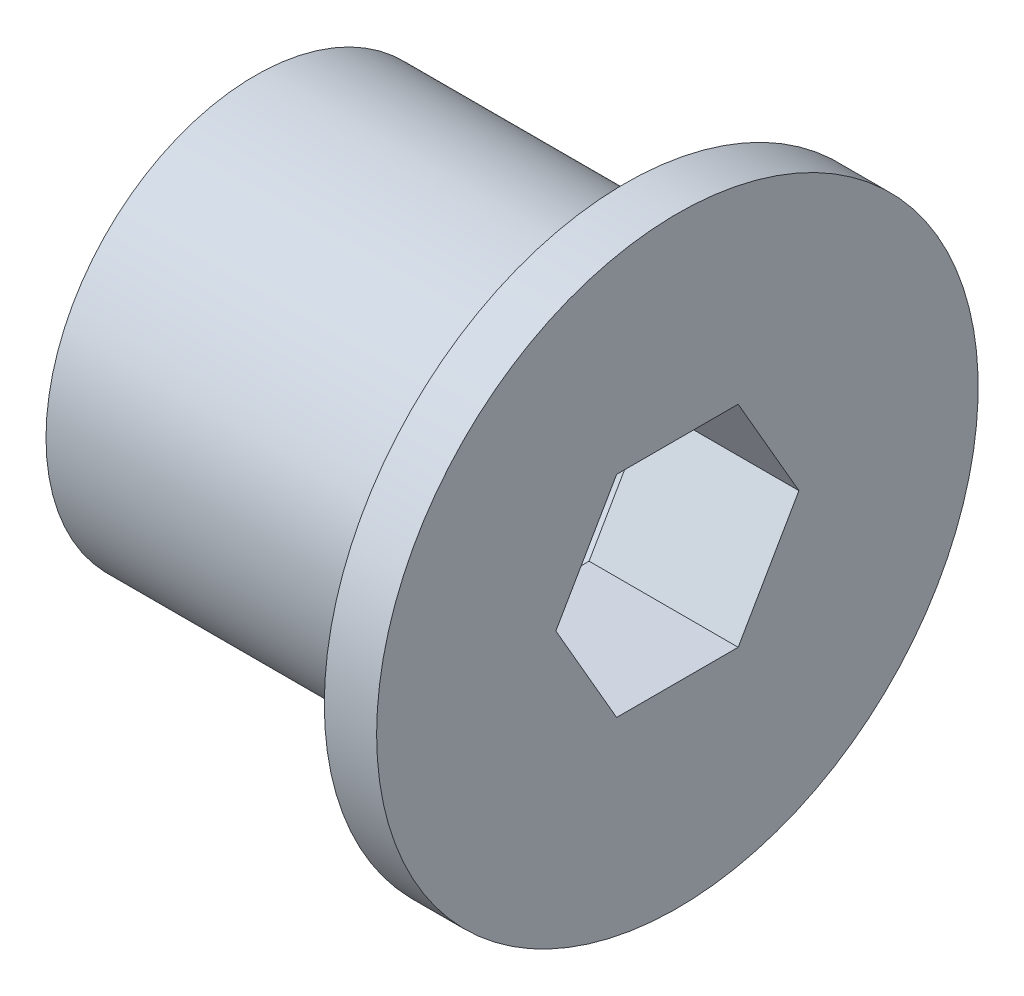
ISO-10303-21;
HEADER;
FILE_DESCRIPTION(('STEP AP214'),'2;1');
FILE_NAME('part.step','',(''),(''),'','','');
FILE_SCHEMA(('AUTOMOTIVE_DESIGN { 1 0 10303 214 1 1 1 1 }'));
ENDSEC;
DATA;
#1=APPLICATION_CONTEXT('core data for automotive mechanical design processes');
#2=APPLICATION_PROTOCOL_DEFINITION('international standard','automotive_design',2000,#1);
#3=PRODUCT_CONTEXT('',#1,'mechanical');
#4=PRODUCT('Part','Part','',(#3));
#5=PRODUCT_RELATED_PRODUCT_CATEGORY('part','',(#4));
#6=PRODUCT_DEFINITION_FORMATION('','',#4);
#7=PRODUCT_DEFINITION_CONTEXT('part definition',#1,'design');
#8=PRODUCT_DEFINITION('design','',#6,#7);
#9=PRODUCT_DEFINITION_SHAPE('','',#8);
#10=(LENGTH_UNIT() NAMED_UNIT(*) SI_UNIT(.MILLI.,.METRE.));
#11=(NAMED_UNIT(*) PLANE_ANGLE_UNIT() SI_UNIT($,.RADIAN.));
#12=(NAMED_UNIT(*) SI_UNIT($,.STERADIAN.) SOLID_ANGLE_UNIT());
#13=UNCERTAINTY_MEASURE_WITH_UNIT(LENGTH_MEASURE(1.E-05),#10,'distance_accuracy_value','');
#14=(GEOMETRIC_REPRESENTATION_CONTEXT(3) GLOBAL_UNCERTAINTY_ASSIGNED_CONTEXT((#13)) GLOBAL_UNIT_ASSIGNED_CONTEXT((#10,
#11,#12)) REPRESENTATION_CONTEXT('',''));
#15=CARTESIAN_POINT('',(0.,0.,0.));
#16=DIRECTION('',(0.,0.,1.));
#17=DIRECTION('',(1.,0.,0.));
#18=AXIS2_PLACEMENT_3D('',#15,#16,#17);
#19=CARTESIAN_POINT('',(-4.841875,0.,0.));
#20=DIRECTION('',(1.,0.,0.));
#21=DIRECTION('',(0.,0.,-1.));
#22=AXIS2_PLACEMENT_3D('',#19,#20,#21);
#23=CYLINDRICAL_SURFACE('',#22,11.8237);
#24=CARTESIAN_POINT('',(-3.571875,0.,0.));
#25=DIRECTION('',(1.,0.,0.));
#26=DIRECTION('',(0.,0.,-1.));
#27=AXIS2_PLACEMENT_3D('',#24,#25,#26);
#28=CIRCLE('',#27,11.8237);
#29=CARTESIAN_POINT('',(-3.571875,0.,-11.8237));
#30=VERTEX_POINT('',#29);
#31=EDGE_CURVE('E125',#30,#30,#28,.T.);
#32=ORIENTED_EDGE('',*,*,#31,.T.);
#33=EDGE_LOOP('',(#32));
#34=FACE_BOUND('',#33,.T.);
#35=CARTESIAN_POINT('',(-4.841875,0.,0.));
#36=DIRECTION('',(1.,0.,0.));
#37=DIRECTION('',(0.,0.,-1.));
#38=AXIS2_PLACEMENT_3D('',#35,#36,#37);
#39=CIRCLE('',#38,11.8237);
#40=CARTESIAN_POINT('',(-4.841875,0.,-11.8237));
#41=VERTEX_POINT('',#40);
#42=EDGE_CURVE('E19',#41,#41,#39,.F.);
#43=ORIENTED_EDGE('',*,*,#42,.T.);
#44=EDGE_LOOP('',(#43));
#45=FACE_BOUND('',#44,.T.);
#46=ADVANCED_FACE('F16',(#34,#45),#23,.F.);
#47=CARTESIAN_POINT('',(-4.841875,0.,0.));
#48=DIRECTION('',(-1.,0.,0.));
#49=DIRECTION('',(0.,0.,1.));
#50=AXIS2_PLACEMENT_3D('',#47,#48,#49);
#51=PLANE('',#50);
#52=ORIENTED_EDGE('',*,*,#42,.F.);
#53=EDGE_LOOP('',(#52));
#54=FACE_BOUND('',#53,.T.);
#55=CARTESIAN_POINT('',(-4.841875,0.,0.));
#56=DIRECTION('',(1.,0.,0.));
#57=DIRECTION('',(0.,0.,-1.));
#58=AXIS2_PLACEMENT_3D('',#55,#56,#57);
#59=CIRCLE('',#58,11.1125);
#60=CARTESIAN_POINT('',(-4.841875,0.,-11.1125));
#61=VERTEX_POINT('',#60);
#62=EDGE_CURVE('E123',#61,#61,#59,.F.);
#63=ORIENTED_EDGE('',*,*,#62,.T.);
#64=EDGE_LOOP('',(#63));
#65=FACE_BOUND('',#64,.T.);
#66=ADVANCED_FACE('F133',(#54,#65),#51,.F.);
#67=CARTESIAN_POINT('',(-3.571875,0.,0.));
#68=DIRECTION('',(1.,0.,0.));
#69=DIRECTION('',(0.,0.,-1.));
#70=AXIS2_PLACEMENT_3D('',#67,#68,#69);
#71=PLANE('',#70);
#72=ORIENTED_EDGE('',*,*,#31,.F.);
#73=EDGE_LOOP('',(#72));
#74=FACE_BOUND('',#73,.T.);
#75=CARTESIAN_POINT('',(-3.571875,0.,0.));
#76=DIRECTION('',(-1.,0.,0.));
#77=DIRECTION('',(0.,0.,1.));
#78=AXIS2_PLACEMENT_3D('',#75,#76,#77);
#79=CIRCLE('',#78,11.1125);
#80=CARTESIAN_POINT('',(-3.571875,0.,11.1125));
#81=VERTEX_POINT('',#80);
#82=EDGE_CURVE('E120',#81,#81,#79,.F.);
#83=ORIENTED_EDGE('',*,*,#82,.T.);
#84=EDGE_LOOP('',(#83));
#85=FACE_BOUND('',#84,.T.);
#86=ADVANCED_FACE('F136',(#74,#85),#71,.F.);
#87=CARTESIAN_POINT('',(-5.857875,0.,0.));
#88=DIRECTION('',(1.,0.,0.));
#89=DIRECTION('',(0.,0.,-1.));
#90=AXIS2_PLACEMENT_3D('',#87,#88,#89);
#91=CYLINDRICAL_SURFACE('',#90,11.1125);
#92=CARTESIAN_POINT('',(-5.857875,0.,0.));
#93=DIRECTION('',(1.,0.,0.));
#94=DIRECTION('',(0.,0.,-1.));
#95=AXIS2_PLACEMENT_3D('',#92,#93,#94);
#96=CIRCLE('',#95,11.1125);
#97=CARTESIAN_POINT('',(-5.857875,0.,-11.1125));
#98=VERTEX_POINT('',#97);
#99=EDGE_CURVE('E117',#98,#98,#96,.T.);
#100=ORIENTED_EDGE('',*,*,#99,.F.);
#101=EDGE_LOOP('',(#100));
#102=FACE_BOUND('',#101,.T.);
#103=ORIENTED_EDGE('',*,*,#62,.F.);
#104=EDGE_LOOP('',(#103));
#105=FACE_BOUND('',#104,.T.);
#106=ADVANCED_FACE('F139',(#102,#105),#91,.F.);
#107=CARTESIAN_POINT('',(3.571875,0.,0.));
#108=DIRECTION('',(-1.,0.,0.));
#109=DIRECTION('',(0.,0.,1.));
#110=AXIS2_PLACEMENT_3D('',#107,#108,#109);
#111=CYLINDRICAL_SURFACE('',#110,11.1125);
#112=ORIENTED_EDGE('',*,*,#82,.F.);
#113=EDGE_LOOP('',(#112));
#114=FACE_BOUND('',#113,.T.);
#115=CARTESIAN_POINT('',(3.571875,0.,0.));
#116=DIRECTION('',(-1.,0.,0.));
#117=DIRECTION('',(0.,0.,1.));
#118=AXIS2_PLACEMENT_3D('',#115,#116,#117);
#119=CIRCLE('',#118,11.1125);
#120=CARTESIAN_POINT('',(3.571875,0.,11.1125));
#121=VERTEX_POINT('',#120);
#122=EDGE_CURVE('E114',#121,#121,#119,.F.);
#123=ORIENTED_EDGE('',*,*,#122,.T.);
#124=EDGE_LOOP('',(#123));
#125=FACE_BOUND('',#124,.T.);
#126=ADVANCED_FACE('F141',(#114,#125),#111,.F.);
#127=CARTESIAN_POINT('',(-5.857875,0.,0.));
#128=DIRECTION('',(-1.,0.,0.));
#129=DIRECTION('',(0.,0.,1.));
#130=AXIS2_PLACEMENT_3D('',#127,#128,#129);
#131=PLANE('',#130);
#132=ORIENTED_EDGE('',*,*,#99,.T.);
#133=EDGE_LOOP('',(#132));
#134=FACE_BOUND('',#133,.T.);
#135=CARTESIAN_POINT('',(-5.857875,0.,0.));
#136=DIRECTION('',(-1.,0.,0.));
#137=DIRECTION('',(0.,0.,1.));
#138=AXIS2_PLACEMENT_3D('',#135,#136,#137);
#139=CIRCLE('',#138,12.7);
#140=CARTESIAN_POINT('',(-5.857875,0.,12.7));
#141=VERTEX_POINT('',#140);
#142=EDGE_CURVE('E111',#141,#141,#139,.F.);
#143=ORIENTED_EDGE('',*,*,#142,.F.);
#144=EDGE_LOOP('',(#143));
#145=FACE_BOUND('',#144,.T.);
#146=ADVANCED_FACE('F149',(#134,#145),#131,.T.);
#147=CARTESIAN_POINT('',(3.571875,0.,0.));
#148=DIRECTION('',(1.,0.,0.));
#149=DIRECTION('',(0.,0.,-1.));
#150=AXIS2_PLACEMENT_3D('',#147,#148,#149);
#151=PLANE('',#150);
#152=ORIENTED_EDGE('',*,*,#122,.F.);
#153=EDGE_LOOP('',(#152));
#154=FACE_BOUND('',#153,.T.);
#155=CARTESIAN_POINT('',(3.571875,0.,0.));
#156=DIRECTION('',(-1.,0.,0.));
#157=DIRECTION('',(0.,0.,1.));
#158=AXIS2_PLACEMENT_3D('',#155,#156,#157);
#159=CIRCLE('',#158,9.525);
#160=CARTESIAN_POINT('',(3.571875,0.,9.525));
#161=VERTEX_POINT('',#160);
#162=EDGE_CURVE('E108',#161,#161,#159,.F.);
#163=ORIENTED_EDGE('',*,*,#162,.T.);
#164=EDGE_LOOP('',(#163));
#165=FACE_BOUND('',#164,.T.);
#166=ADVANCED_FACE('F201',(#154,#165),#151,.F.);
#167=CARTESIAN_POINT('',(3.571875,0.,0.));
#168=DIRECTION('',(-1.,0.,0.));
#169=DIRECTION('',(0.,0.,1.));
#170=AXIS2_PLACEMENT_3D('',#167,#168,#169);
#171=CYLINDRICAL_SURFACE('',#170,12.7);
#172=ORIENTED_EDGE('',*,*,#142,.T.);
#173=EDGE_LOOP('',(#172));
#174=FACE_BOUND('',#173,.T.);
#175=CARTESIAN_POINT('',(16.589375,0.,0.));
#176=DIRECTION('',(-1.,0.,0.));
#177=DIRECTION('',(0.,0.,1.));
#178=AXIS2_PLACEMENT_3D('',#175,#176,#177);
#179=CIRCLE('',#178,12.7);
#180=CARTESIAN_POINT('',(16.589375,0.,12.7));
#181=VERTEX_POINT('',#180);
#182=EDGE_CURVE('E105',#181,#181,#179,.T.);
#183=ORIENTED_EDGE('',*,*,#182,.T.);
#184=EDGE_LOOP('',(#183));
#185=FACE_BOUND('',#184,.T.);
#186=ADVANCED_FACE('F197',(#174,#185),#171,.T.);
#187=CARTESIAN_POINT('',(10.715625,0.,0.));
#188=DIRECTION('',(-1.,0.,0.));
#189=DIRECTION('',(0.,0.,1.));
#190=AXIS2_PLACEMENT_3D('',#187,#188,#189);
#191=CYLINDRICAL_SURFACE('',#190,9.525);
#192=ORIENTED_EDGE('',*,*,#162,.F.);
#193=EDGE_LOOP('',(#192));
#194=FACE_BOUND('',#193,.T.);
#195=CARTESIAN_POINT('',(10.715625,0.,0.));
#196=DIRECTION('',(-1.,0.,0.));
#197=DIRECTION('',(0.,0.,1.));
#198=AXIS2_PLACEMENT_3D('',#195,#196,#197);
#199=CIRCLE('',#198,9.525);
#200=CARTESIAN_POINT('',(10.715625,0.,9.525));
#201=VERTEX_POINT('',#200);
#202=EDGE_CURVE('E102',#201,#201,#199,.F.);
#203=ORIENTED_EDGE('',*,*,#202,.T.);
#204=EDGE_LOOP('',(#203));
#205=FACE_BOUND('',#204,.T.);
#206=ADVANCED_FACE('F193',(#194,#205),#191,.F.);
#207=CARTESIAN_POINT('',(16.589375,0.,0.));
#208=DIRECTION('',(1.,0.,0.));
#209=DIRECTION('',(0.,0.,-1.));
#210=AXIS2_PLACEMENT_3D('',#207,#208,#209);
#211=PLANE('',#210);
#212=ORIENTED_EDGE('',*,*,#182,.F.);
#213=EDGE_LOOP('',(#212));
#214=FACE_BOUND('',#213,.T.);
#215=CARTESIAN_POINT('',(16.589375,0.,0.));
#216=DIRECTION('',(-1.,0.,0.));
#217=DIRECTION('',(0.,0.,1.));
#218=AXIS2_PLACEMENT_3D('',#215,#216,#217);
#219=CIRCLE('',#218,18.25625);
#220=CARTESIAN_POINT('',(16.589375,0.,18.25625));
#221=VERTEX_POINT('',#220);
#222=EDGE_CURVE('E85',#221,#221,#219,.F.);
#223=ORIENTED_EDGE('',*,*,#222,.F.);
#224=EDGE_LOOP('',(#223));
#225=FACE_BOUND('',#224,.T.);
#226=ADVANCED_FACE('F189',(#214,#225),#211,.F.);
#227=CARTESIAN_POINT('',(10.715625,0.,0.));
#228=DIRECTION('',(1.,0.,0.));
#229=DIRECTION('',(0.,0.,-1.));
#230=AXIS2_PLACEMENT_3D('',#227,#228,#229);
#231=PLANE('',#230);
#232=ORIENTED_EDGE('',*,*,#202,.F.);
#233=EDGE_LOOP('',(#232));
#234=FACE_BOUND('',#233,.T.);
#235=DIRECTION('',(0.,-0.866025403784439,-0.5));
#236=VECTOR('',#235,1.);
#237=CARTESIAN_POINT('',(10.715625,0.,-7.3763425092205));
#238=LINE('',#237,#236);
#239=CARTESIAN_POINT('',(10.715625,6.3881,-3.68817125461025));
#240=VERTEX_POINT('',#239);
#241=CARTESIAN_POINT('',(10.715625,0.,-7.3763425092205));
#242=VERTEX_POINT('',#241);
#243=EDGE_CURVE('E72',#240,#242,#238,.T.);
#244=ORIENTED_EDGE('',*,*,#243,.F.);
#245=DIRECTION('',(0.,0.,-1.));
#246=VECTOR('',#245,1.);
#247=CARTESIAN_POINT('',(10.715625,6.3881,-3.68817125461025));
#248=LINE('',#247,#246);
#249=CARTESIAN_POINT('',(10.715625,6.3881,3.68817125461025));
#250=VERTEX_POINT('',#249);
#251=EDGE_CURVE('E360',#250,#240,#248,.T.);
#252=ORIENTED_EDGE('',*,*,#251,.F.);
#253=DIRECTION('',(0.,0.866025403784439,-0.5));
#254=VECTOR('',#253,1.);
#255=CARTESIAN_POINT('',(10.715625,6.3881,3.68817125461025));
#256=LINE('',#255,#254);
#257=CARTESIAN_POINT('',(10.715625,0.,7.37634250922049));
#258=VERTEX_POINT('',#257);
#259=EDGE_CURVE('E365',#258,#250,#256,.T.);
#260=ORIENTED_EDGE('',*,*,#259,.F.);
#261=DIRECTION('',(0.,0.866025403784439,0.5));
#262=VECTOR('',#261,1.);
#263=CARTESIAN_POINT('',(10.715625,0.,7.37634250922049));
#264=LINE('',#263,#262);
#265=CARTESIAN_POINT('',(10.715625,-6.3881,3.68817125461024));
#266=VERTEX_POINT('',#265);
#267=EDGE_CURVE('E368',#266,#258,#264,.T.);
#268=ORIENTED_EDGE('',*,*,#267,.F.);
#269=DIRECTION('',(0.,0.,1.));
#270=VECTOR('',#269,1.);
#271=CARTESIAN_POINT('',(10.715625,-6.3881,3.68817125461024));
#272=LINE('',#271,#270);
#273=CARTESIAN_POINT('',(10.715625,-6.3881,-3.68817125461025));
#274=VERTEX_POINT('',#273);
#275=EDGE_CURVE('E67',#274,#266,#272,.T.);
#276=ORIENTED_EDGE('',*,*,#275,.F.);
#277=DIRECTION('',(0.,-0.866025403784439,0.499999999999999));
#278=VECTOR('',#277,1.);
#279=CARTESIAN_POINT('',(10.715625,-6.3881,-3.68817125461025));
#280=LINE('',#279,#278);
#281=EDGE_CURVE('E69',#242,#274,#280,.T.);
#282=ORIENTED_EDGE('',*,*,#281,.F.);
#283=EDGE_LOOP('',(#244,#252,#260,#268,#276,#282));
#284=FACE_BOUND('',#283,.T.);
#285=ADVANCED_FACE('F71',(#234,#284),#231,.F.);
#286=CARTESIAN_POINT('',(19.764375,0.,0.));
#287=DIRECTION('',(-1.,0.,0.));
#288=DIRECTION('',(0.,0.,1.));
#289=AXIS2_PLACEMENT_3D('',#286,#287,#288);
#290=CYLINDRICAL_SURFACE('',#289,18.25625);
#291=ORIENTED_EDGE('',*,*,#222,.T.);
#292=EDGE_LOOP('',(#291));
#293=FACE_BOUND('',#292,.T.);
#294=CARTESIAN_POINT('',(19.764375,0.,0.));
#295=DIRECTION('',(-1.,0.,0.));
#296=DIRECTION('',(0.,0.,1.));
#297=AXIS2_PLACEMENT_3D('',#294,#295,#296);
#298=CIRCLE('',#297,18.25625);
#299=CARTESIAN_POINT('',(19.764375,0.,18.25625));
#300=VERTEX_POINT('',#299);
#301=EDGE_CURVE('E96',#300,#300,#298,.F.);
#302=ORIENTED_EDGE('',*,*,#301,.F.);
#303=EDGE_LOOP('',(#302));
#304=FACE_BOUND('',#303,.T.);
#305=ADVANCED_FACE('F183',(#293,#304),#290,.T.);
#306=CARTESIAN_POINT('',(19.764375,0.,-7.3763425092205));
#307=DIRECTION('',(0.,-0.5,0.866025403784439));
#308=DIRECTION('',(0.,-0.866025403784439,-0.5));
#309=AXIS2_PLACEMENT_3D('',#306,#307,#308);
#310=PLANE('',#309);
#311=DIRECTION('',(0.,-0.866025403784439,-0.5));
#312=VECTOR('',#311,1.);
#313=CARTESIAN_POINT('',(19.764375,6.3881,-3.68817125461025));
#314=LINE('',#313,#312);
#315=CARTESIAN_POINT('',(19.764375,6.3881,-3.68817125461025));
#316=VERTEX_POINT('',#315);
#317=CARTESIAN_POINT('',(19.764375,0.,-7.3763425092205));
#318=VERTEX_POINT('',#317);
#319=EDGE_CURVE('E99',#316,#318,#314,.T.);
#320=ORIENTED_EDGE('',*,*,#319,.F.);
#321=DIRECTION('',(1.,0.,0.));
#322=VECTOR('',#321,1.);
#323=CARTESIAN_POINT('',(19.764375,6.3881,-3.68817125461025));
#324=LINE('',#323,#322);
#325=EDGE_CURVE('E83',#240,#316,#324,.T.);
#326=ORIENTED_EDGE('',*,*,#325,.F.);
#327=ORIENTED_EDGE('',*,*,#243,.T.);
#328=DIRECTION('',(1.,0.,0.));
#329=VECTOR('',#328,1.);
#330=CARTESIAN_POINT('',(19.764375,0.,-7.3763425092205));
#331=LINE('',#330,#329);
#332=EDGE_CURVE('E77',#318,#242,#331,.F.);
#333=ORIENTED_EDGE('',*,*,#332,.F.);
#334=EDGE_LOOP('',(#320,#326,#327,#333));
#335=FACE_BOUND('',#334,.T.);
#336=ADVANCED_FACE('F80',(#335),#310,.T.);
#337=CARTESIAN_POINT('',(19.764375,-6.3881,-3.68817125461025));
#338=DIRECTION('',(0.,0.499999999999999,0.866025403784439));
#339=DIRECTION('',(0.,-0.866025403784439,0.499999999999999));
#340=AXIS2_PLACEMENT_3D('',#337,#338,#339);
#341=PLANE('',#340);
#342=DIRECTION('',(0.,-0.866025403784439,0.499999999999999));
#343=VECTOR('',#342,1.);
#344=CARTESIAN_POINT('',(19.764375,0.,-7.3763425092205));
#345=LINE('',#344,#343);
#346=CARTESIAN_POINT('',(19.764375,-6.3881,-3.68817125461025));
#347=VERTEX_POINT('',#346);
#348=EDGE_CURVE('E89',#318,#347,#345,.T.);
#349=ORIENTED_EDGE('',*,*,#348,.F.);
#350=ORIENTED_EDGE('',*,*,#332,.T.);
#351=ORIENTED_EDGE('',*,*,#281,.T.);
#352=DIRECTION('',(1.,0.,0.));
#353=VECTOR('',#352,1.);
#354=CARTESIAN_POINT('',(19.764375,-6.3881,-3.68817125461025));
#355=LINE('',#354,#353);
#356=EDGE_CURVE('E92',#347,#274,#355,.F.);
#357=ORIENTED_EDGE('',*,*,#356,.F.);
#358=EDGE_LOOP('',(#349,#350,#351,#357));
#359=FACE_BOUND('',#358,.T.);
#360=ADVANCED_FACE('F87',(#359),#341,.T.);
#361=CARTESIAN_POINT('',(19.764375,-6.3881,3.68817125461024));
#362=DIRECTION('',(0.,1.,0.));
#363=DIRECTION('',(0.,0.,1.));
#364=AXIS2_PLACEMENT_3D('',#361,#362,#363);
#365=PLANE('',#364);
#366=DIRECTION('',(0.,0.,-1.));
#367=VECTOR('',#366,1.);
#368=CARTESIAN_POINT('',(19.764375,-6.3881,0.));
#369=LINE('',#368,#367);
#370=CARTESIAN_POINT('',(19.764375,-6.3881,3.68817125461024));
#371=VERTEX_POINT('',#370);
#372=EDGE_CURVE('E347',#347,#371,#369,.F.);
#373=ORIENTED_EDGE('',*,*,#372,.F.);
#374=ORIENTED_EDGE('',*,*,#356,.T.);
#375=ORIENTED_EDGE('',*,*,#275,.T.);
#376=DIRECTION('',(1.,0.,0.));
#377=VECTOR('',#376,1.);
#378=CARTESIAN_POINT('',(19.764375,-6.3881,3.68817125461024));
#379=LINE('',#378,#377);
#380=EDGE_CURVE('E349',#371,#266,#379,.F.);
#381=ORIENTED_EDGE('',*,*,#380,.F.);
#382=EDGE_LOOP('',(#373,#374,#375,#381));
#383=FACE_BOUND('',#382,.T.);
#384=ADVANCED_FACE('F174',(#383),#365,.T.);
#385=CARTESIAN_POINT('',(19.764375,0.,7.37634250922049));
#386=DIRECTION('',(0.,0.5,-0.866025403784439));
#387=DIRECTION('',(0.,0.866025403784439,0.5));
#388=AXIS2_PLACEMENT_3D('',#385,#386,#387);
#389=PLANE('',#388);
#390=DIRECTION('',(0.,0.866025403784438,0.5));
#391=VECTOR('',#390,1.);
#392=CARTESIAN_POINT('',(19.764375,-6.3881,3.68817125461024));
#393=LINE('',#392,#391);
#394=CARTESIAN_POINT('',(19.764375,0.,7.37634250922049));
#395=VERTEX_POINT('',#394);
#396=EDGE_CURVE('E352',#371,#395,#393,.T.);
#397=ORIENTED_EDGE('',*,*,#396,.F.);
#398=ORIENTED_EDGE('',*,*,#380,.T.);
#399=ORIENTED_EDGE('',*,*,#267,.T.);
#400=DIRECTION('',(1.,0.,0.));
#401=VECTOR('',#400,1.);
#402=CARTESIAN_POINT('',(19.764375,0.,7.37634250922049));
#403=LINE('',#402,#401);
#404=EDGE_CURVE('E362',#395,#258,#403,.F.);
#405=ORIENTED_EDGE('',*,*,#404,.F.);
#406=EDGE_LOOP('',(#397,#398,#399,#405));
#407=FACE_BOUND('',#406,.T.);
#408=ADVANCED_FACE('F171',(#407),#389,.T.);
#409=CARTESIAN_POINT('',(19.764375,6.3881,3.68817125461025));
#410=DIRECTION('',(0.,-0.5,-0.866025403784439));
#411=DIRECTION('',(0.,0.866025403784439,-0.5));
#412=AXIS2_PLACEMENT_3D('',#409,#410,#411);
#413=PLANE('',#412);
#414=DIRECTION('',(0.,0.866025403784439,-0.5));
#415=VECTOR('',#414,1.);
#416=CARTESIAN_POINT('',(19.764375,0.,7.37634250922049));
#417=LINE('',#416,#415);
#418=CARTESIAN_POINT('',(19.764375,6.3881,3.68817125461025));
#419=VERTEX_POINT('',#418);
#420=EDGE_CURVE('E25',#395,#419,#417,.T.);
#421=ORIENTED_EDGE('',*,*,#420,.F.);
#422=ORIENTED_EDGE('',*,*,#404,.T.);
#423=ORIENTED_EDGE('',*,*,#259,.T.);
#424=DIRECTION('',(1.,0.,0.));
#425=VECTOR('',#424,1.);
#426=CARTESIAN_POINT('',(19.764375,6.3881,3.68817125461025));
#427=LINE('',#426,#425);
#428=EDGE_CURVE('E34',#419,#250,#427,.F.);
#429=ORIENTED_EDGE('',*,*,#428,.F.);
#430=EDGE_LOOP('',(#421,#422,#423,#429));
#431=FACE_BOUND('',#430,.T.);
#432=ADVANCED_FACE('F163',(#431),#413,.T.);
#433=CARTESIAN_POINT('',(19.764375,6.3881,-3.68817125461025));
#434=DIRECTION('',(0.,-1.,0.));
#435=DIRECTION('',(0.,0.,-1.));
#436=AXIS2_PLACEMENT_3D('',#433,#434,#435);
#437=PLANE('',#436);
#438=DIRECTION('',(0.,0.,-1.));
#439=VECTOR('',#438,1.);
#440=CARTESIAN_POINT('',(19.764375,6.3881,0.));
#441=LINE('',#440,#439);
#442=EDGE_CURVE('E11',#419,#316,#441,.T.);
#443=ORIENTED_EDGE('',*,*,#442,.F.);
#444=ORIENTED_EDGE('',*,*,#428,.T.);
#445=ORIENTED_EDGE('',*,*,#251,.T.);
#446=ORIENTED_EDGE('',*,*,#325,.T.);
#447=EDGE_LOOP('',(#443,#444,#445,#446));
#448=FACE_BOUND('',#447,.T.);
#449=ADVANCED_FACE('F157',(#448),#437,.T.);
#450=CARTESIAN_POINT('',(19.764375,0.,0.));
#451=DIRECTION('',(1.,0.,0.));
#452=DIRECTION('',(0.,0.,-1.));
#453=AXIS2_PLACEMENT_3D('',#450,#451,#452);
#454=PLANE('',#453);
#455=ORIENTED_EDGE('',*,*,#420,.T.);
#456=ORIENTED_EDGE('',*,*,#442,.T.);
#457=ORIENTED_EDGE('',*,*,#319,.T.);
#458=ORIENTED_EDGE('',*,*,#348,.T.);
#459=ORIENTED_EDGE('',*,*,#372,.T.);
#460=ORIENTED_EDGE('',*,*,#396,.T.);
#461=EDGE_LOOP('',(#455,#456,#457,#458,#459,#460));
#462=FACE_BOUND('',#461,.T.);
#463=ORIENTED_EDGE('',*,*,#301,.T.);
#464=EDGE_LOOP('',(#463));
#465=FACE_BOUND('',#464,.T.);
#466=ADVANCED_FACE('F155',(#462,#465),#454,.T.);
#467=CLOSED_SHELL('',(#46,#66,#86,#106,#126,#146,#166,#186,#206,#226,#285,#305,#336,#360,#384,
#408,#432,#449,#466));
#468=MANIFOLD_SOLID_BREP('B1',#467);
#469=ADVANCED_BREP_SHAPE_REPRESENTATION('',(#18,#468),#14);
#470=SHAPE_DEFINITION_REPRESENTATION(#9,#469);
ENDSEC;
END-ISO-10303-21;
